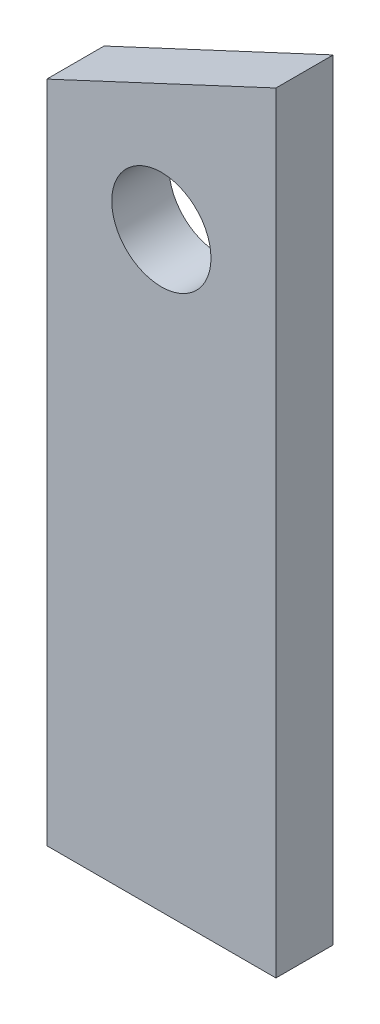
ISO-10303-21;
HEADER;
FILE_DESCRIPTION(('STEP AP214'),'2;1');
FILE_NAME('part.step','',(''),(''),'','','');
FILE_SCHEMA(('AUTOMOTIVE_DESIGN { 1 0 10303 214 1 1 1 1 }'));
ENDSEC;
DATA;
#1=APPLICATION_CONTEXT('core data for automotive mechanical design processes');
#2=APPLICATION_PROTOCOL_DEFINITION('international standard','automotive_design',2000,#1);
#3=PRODUCT_CONTEXT('',#1,'mechanical');
#4=PRODUCT('Part','Part','',(#3));
#5=PRODUCT_RELATED_PRODUCT_CATEGORY('part','',(#4));
#6=PRODUCT_DEFINITION_FORMATION('','',#4);
#7=PRODUCT_DEFINITION_CONTEXT('part definition',#1,'design');
#8=PRODUCT_DEFINITION('design','',#6,#7);
#9=PRODUCT_DEFINITION_SHAPE('','',#8);
#10=(LENGTH_UNIT() NAMED_UNIT(*) SI_UNIT(.MILLI.,.METRE.));
#11=(NAMED_UNIT(*) PLANE_ANGLE_UNIT() SI_UNIT($,.RADIAN.));
#12=(NAMED_UNIT(*) SI_UNIT($,.STERADIAN.) SOLID_ANGLE_UNIT());
#13=UNCERTAINTY_MEASURE_WITH_UNIT(LENGTH_MEASURE(1.E-05),#10,'distance_accuracy_value','');
#14=(GEOMETRIC_REPRESENTATION_CONTEXT(3) GLOBAL_UNCERTAINTY_ASSIGNED_CONTEXT((#13)) GLOBAL_UNIT_ASSIGNED_CONTEXT((#10,
#11,#12)) REPRESENTATION_CONTEXT('',''));
#15=CARTESIAN_POINT('',(0.,0.,0.));
#16=DIRECTION('',(0.,0.,1.));
#17=DIRECTION('',(1.,0.,0.));
#18=AXIS2_PLACEMENT_3D('',#15,#16,#17);
#19=CARTESIAN_POINT('',(0.,63.5,0.));
#20=DIRECTION('',(1.,0.,0.));
#21=DIRECTION('',(0.,0.,-1.));
#22=AXIS2_PLACEMENT_3D('',#19,#20,#21);
#23=PLANE('',#22);
#24=DIRECTION('',(0.,0.,1.));
#25=VECTOR('',#24,1.);
#26=CARTESIAN_POINT('',(0.,36.7991277495379,-0.00100000000000013));
#27=LINE('',#26,#25);
#28=CARTESIAN_POINT('',(0.,36.7991277495379,0.));
#29=VERTEX_POINT('',#28);
#30=CARTESIAN_POINT('',(0.,36.7991277495379,3.175));
#31=VERTEX_POINT('',#30);
#32=EDGE_CURVE('E88',#29,#31,#27,.T.);
#33=ORIENTED_EDGE('',*,*,#32,.F.);
#34=DIRECTION('',(0.,-1.,0.));
#35=VECTOR('',#34,1.);
#36=CARTESIAN_POINT('',(0.,63.5,0.));
#37=LINE('',#36,#35);
#38=CARTESIAN_POINT('',(0.,0.,0.));
#39=VERTEX_POINT('',#38);
#40=EDGE_CURVE('E70',#29,#39,#37,.T.);
#41=ORIENTED_EDGE('',*,*,#40,.T.);
#42=DIRECTION('',(0.,0.,1.));
#43=VECTOR('',#42,1.);
#44=CARTESIAN_POINT('',(0.,0.,0.));
#45=LINE('',#44,#43);
#46=CARTESIAN_POINT('',(0.,0.,3.175));
#47=VERTEX_POINT('',#46);
#48=EDGE_CURVE('E119',#39,#47,#45,.T.);
#49=ORIENTED_EDGE('',*,*,#48,.T.);
#50=DIRECTION('',(0.,-1.,0.));
#51=VECTOR('',#50,1.);
#52=CARTESIAN_POINT('',(0.,63.5,3.175));
#53=LINE('',#52,#51);
#54=EDGE_CURVE('E11',#31,#47,#53,.T.);
#55=ORIENTED_EDGE('',*,*,#54,.F.);
#56=EDGE_LOOP('',(#33,#41,#49,#55));
#57=FACE_BOUND('',#56,.T.);
#58=ADVANCED_FACE('F48',(#57),#23,.F.);
#59=CARTESIAN_POINT('',(0.,63.5,3.175));
#60=DIRECTION('',(0.,0.,-1.));
#61=DIRECTION('',(-1.,0.,0.));
#62=AXIS2_PLACEMENT_3D('',#59,#60,#61);
#63=PLANE('',#62);
#64=DIRECTION('',(-0.906307787036647,-0.422618261740705,0.));
#65=VECTOR('',#64,1.);
#66=CARTESIAN_POINT('',(12.7231490471833,42.7320295860871,3.175));
#67=LINE('',#66,#65);
#68=CARTESIAN_POINT('',(12.7,42.7212350081065,3.175));
#69=VERTEX_POINT('',#68);
#70=EDGE_CURVE('E92',#69,#31,#67,.T.);
#71=ORIENTED_EDGE('',*,*,#70,.T.);
#72=ORIENTED_EDGE('',*,*,#54,.T.);
#73=DIRECTION('',(1.,0.,0.));
#74=VECTOR('',#73,1.);
#75=CARTESIAN_POINT('',(0.,0.,3.175));
#76=LINE('',#75,#74);
#77=CARTESIAN_POINT('',(12.7,0.,3.175));
#78=VERTEX_POINT('',#77);
#79=EDGE_CURVE('E115',#47,#78,#76,.T.);
#80=ORIENTED_EDGE('',*,*,#79,.T.);
#81=DIRECTION('',(0.,-1.,0.));
#82=VECTOR('',#81,1.);
#83=CARTESIAN_POINT('',(12.7,63.5,3.175));
#84=LINE('',#83,#82);
#85=EDGE_CURVE('E55',#69,#78,#84,.T.);
#86=ORIENTED_EDGE('',*,*,#85,.F.);
#87=EDGE_LOOP('',(#71,#72,#80,#86));
#88=FACE_BOUND('',#87,.T.);
#89=CARTESIAN_POINT('',(6.35,32.7507925209973,3.175));
#90=DIRECTION('',(0.,0.,-1.));
#91=DIRECTION('',(-1.,0.,0.));
#92=AXIS2_PLACEMENT_3D('',#89,#90,#91);
#93=CIRCLE('',#92,2.75);
#94=CARTESIAN_POINT('',(3.6,32.7507925209973,3.175));
#95=VERTEX_POINT('',#94);
#96=EDGE_CURVE('E124',#95,#95,#93,.T.);
#97=ORIENTED_EDGE('',*,*,#96,.T.);
#98=EDGE_LOOP('',(#97));
#99=FACE_BOUND('',#98,.T.);
#100=ADVANCED_FACE('F116',(#88,#99),#63,.F.);
#101=CARTESIAN_POINT('',(12.7,63.5,0.));
#102=DIRECTION('',(-1.,0.,0.));
#103=DIRECTION('',(0.,0.,1.));
#104=AXIS2_PLACEMENT_3D('',#101,#102,#103);
#105=PLANE('',#104);
#106=DIRECTION('',(0.,0.,1.));
#107=VECTOR('',#106,1.);
#108=CARTESIAN_POINT('',(12.7,42.7212350081065,-0.00100000000000013));
#109=LINE('',#108,#107);
#110=CARTESIAN_POINT('',(12.7,42.7212350081065,0.));
#111=VERTEX_POINT('',#110);
#112=EDGE_CURVE('E62',#111,#69,#109,.T.);
#113=ORIENTED_EDGE('',*,*,#112,.T.);
#114=ORIENTED_EDGE('',*,*,#85,.T.);
#115=DIRECTION('',(0.,0.,-1.));
#116=VECTOR('',#115,1.);
#117=CARTESIAN_POINT('',(12.7,0.,0.));
#118=LINE('',#117,#116);
#119=CARTESIAN_POINT('',(12.7,0.,0.));
#120=VERTEX_POINT('',#119);
#121=EDGE_CURVE('E104',#78,#120,#118,.T.);
#122=ORIENTED_EDGE('',*,*,#121,.T.);
#123=DIRECTION('',(0.,-1.,0.));
#124=VECTOR('',#123,1.);
#125=CARTESIAN_POINT('',(12.7,63.5,0.));
#126=LINE('',#125,#124);
#127=EDGE_CURVE('E101',#111,#120,#126,.T.);
#128=ORIENTED_EDGE('',*,*,#127,.F.);
#129=EDGE_LOOP('',(#113,#114,#122,#128));
#130=FACE_BOUND('',#129,.T.);
#131=ADVANCED_FACE('F111',(#130),#105,.F.);
#132=CARTESIAN_POINT('',(0.,63.5,0.));
#133=DIRECTION('',(0.,0.,1.));
#134=DIRECTION('',(1.,0.,0.));
#135=AXIS2_PLACEMENT_3D('',#132,#133,#134);
#136=PLANE('',#135);
#137=DIRECTION('',(0.906307787036647,0.422618261740705,0.));
#138=VECTOR('',#137,1.);
#139=CARTESIAN_POINT('',(12.7231490471833,42.7320295860871,0.));
#140=LINE('',#139,#138);
#141=EDGE_CURVE('E86',#29,#111,#140,.T.);
#142=ORIENTED_EDGE('',*,*,#141,.T.);
#143=ORIENTED_EDGE('',*,*,#127,.T.);
#144=DIRECTION('',(-1.,0.,0.));
#145=VECTOR('',#144,1.);
#146=CARTESIAN_POINT('',(0.,0.,0.));
#147=LINE('',#146,#145);
#148=EDGE_CURVE('E99',#120,#39,#147,.T.);
#149=ORIENTED_EDGE('',*,*,#148,.T.);
#150=ORIENTED_EDGE('',*,*,#40,.F.);
#151=EDGE_LOOP('',(#142,#143,#149,#150));
#152=FACE_BOUND('',#151,.T.);
#153=CARTESIAN_POINT('',(6.35,32.7507925209973,0.));
#154=DIRECTION('',(0.,0.,1.));
#155=DIRECTION('',(1.,0.,0.));
#156=AXIS2_PLACEMENT_3D('',#153,#154,#155);
#157=CIRCLE('',#156,2.75);
#158=CARTESIAN_POINT('',(9.1,32.7507925209973,0.));
#159=VERTEX_POINT('',#158);
#160=EDGE_CURVE('E125',#159,#159,#157,.T.);
#161=ORIENTED_EDGE('',*,*,#160,.T.);
#162=EDGE_LOOP('',(#161));
#163=FACE_BOUND('',#162,.T.);
#164=ADVANCED_FACE('F96',(#152,#163),#136,.F.);
#165=CARTESIAN_POINT('',(0.,0.,0.));
#166=DIRECTION('',(0.,1.,0.));
#167=DIRECTION('',(0.,0.,1.));
#168=AXIS2_PLACEMENT_3D('',#165,#166,#167);
#169=PLANE('',#168);
#170=ORIENTED_EDGE('',*,*,#48,.F.);
#171=ORIENTED_EDGE('',*,*,#148,.F.);
#172=ORIENTED_EDGE('',*,*,#121,.F.);
#173=ORIENTED_EDGE('',*,*,#79,.F.);
#174=EDGE_LOOP('',(#170,#171,#172,#173));
#175=FACE_BOUND('',#174,.T.);
#176=ADVANCED_FACE('F121',(#175),#169,.F.);
#177=CARTESIAN_POINT('',(12.7231490471833,42.7320295860871,-0.00100000000000013));
#178=DIRECTION('',(-0.422618261740705,0.906307787036647,0.));
#179=DIRECTION('',(-0.906307787036647,-0.422618261740705,0.));
#180=AXIS2_PLACEMENT_3D('',#177,#178,#179);
#181=PLANE('',#180);
#182=ORIENTED_EDGE('',*,*,#141,.F.);
#183=ORIENTED_EDGE('',*,*,#32,.T.);
#184=ORIENTED_EDGE('',*,*,#70,.F.);
#185=ORIENTED_EDGE('',*,*,#112,.F.);
#186=EDGE_LOOP('',(#182,#183,#184,#185));
#187=FACE_BOUND('',#186,.T.);
#188=ADVANCED_FACE('F87',(#187),#181,.T.);
#189=CARTESIAN_POINT('',(6.35,32.7507925209973,-0.00100000000000013));
#190=DIRECTION('',(0.,0.,1.));
#191=DIRECTION('',(1.,0.,0.));
#192=AXIS2_PLACEMENT_3D('',#189,#190,#191);
#193=CYLINDRICAL_SURFACE('',#192,2.75);
#194=ORIENTED_EDGE('',*,*,#96,.F.);
#195=EDGE_LOOP('',(#194));
#196=FACE_BOUND('',#195,.T.);
#197=ORIENTED_EDGE('',*,*,#160,.F.);
#198=EDGE_LOOP('',(#197));
#199=FACE_BOUND('',#198,.T.);
#200=ADVANCED_FACE('F133',(#196,#199),#193,.F.);
#201=CLOSED_SHELL('',(#58,#100,#131,#164,#176,#188,#200));
#202=MANIFOLD_SOLID_BREP('B2',#201);
#203=ADVANCED_BREP_SHAPE_REPRESENTATION('',(#18,#202),#14);
#204=SHAPE_DEFINITION_REPRESENTATION(#9,#203);
ENDSEC;
END-ISO-10303-21;
